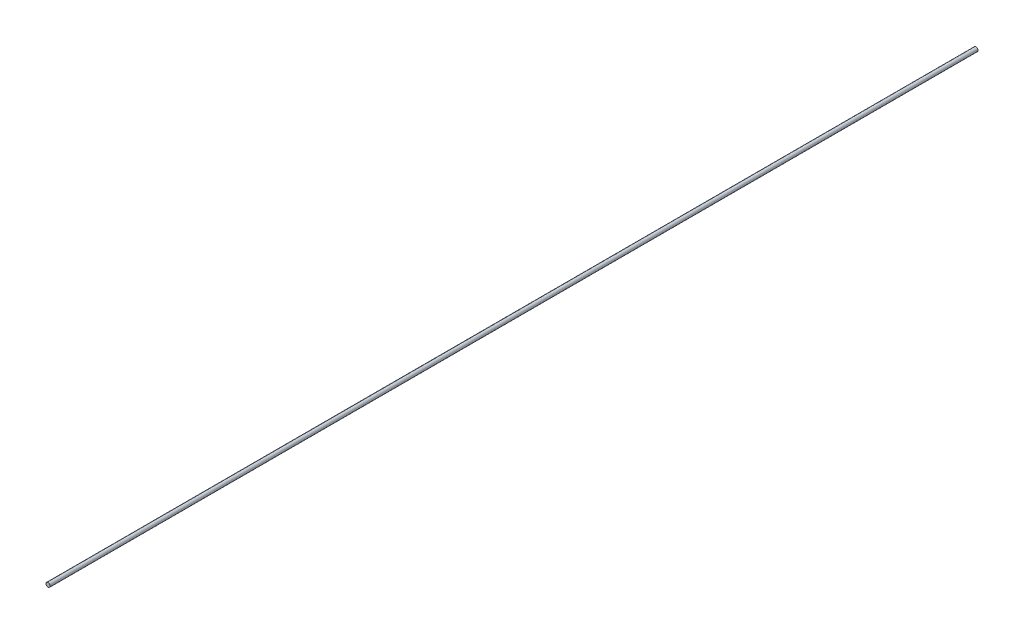
ISO-10303-21;
HEADER;
FILE_DESCRIPTION(('STEP AP214'),'2;1');
FILE_NAME('part.step','',(''),(''),'','','');
FILE_SCHEMA(('AUTOMOTIVE_DESIGN { 1 0 10303 214 1 1 1 1 }'));
ENDSEC;
DATA;
#1=APPLICATION_CONTEXT('core data for automotive mechanical design processes');
#2=APPLICATION_PROTOCOL_DEFINITION('international standard','automotive_design',2000,#1);
#3=PRODUCT_CONTEXT('',#1,'mechanical');
#4=PRODUCT('Part','Part','',(#3));
#5=PRODUCT_RELATED_PRODUCT_CATEGORY('part','',(#4));
#6=PRODUCT_DEFINITION_FORMATION('','',#4);
#7=PRODUCT_DEFINITION_CONTEXT('part definition',#1,'design');
#8=PRODUCT_DEFINITION('design','',#6,#7);
#9=PRODUCT_DEFINITION_SHAPE('','',#8);
#10=(LENGTH_UNIT() NAMED_UNIT(*) SI_UNIT(.MILLI.,.METRE.));
#11=(NAMED_UNIT(*) PLANE_ANGLE_UNIT() SI_UNIT($,.RADIAN.));
#12=(NAMED_UNIT(*) SI_UNIT($,.STERADIAN.) SOLID_ANGLE_UNIT());
#13=UNCERTAINTY_MEASURE_WITH_UNIT(LENGTH_MEASURE(1.E-05),#10,'distance_accuracy_value','');
#14=(GEOMETRIC_REPRESENTATION_CONTEXT(3) GLOBAL_UNCERTAINTY_ASSIGNED_CONTEXT((#13)) GLOBAL_UNIT_ASSIGNED_CONTEXT((#10,
#11,#12)) REPRESENTATION_CONTEXT('',''));
#15=CARTESIAN_POINT('',(0.,0.,0.));
#16=DIRECTION('',(0.,0.,1.));
#17=DIRECTION('',(1.,0.,0.));
#18=AXIS2_PLACEMENT_3D('',#15,#16,#17);
#19=CARTESIAN_POINT('',(0.,0.,1346.2));
#20=DIRECTION('',(0.,0.,-1.));
#21=DIRECTION('',(-1.,0.,0.));
#22=AXIS2_PLACEMENT_3D('',#19,#20,#21);
#23=CYLINDRICAL_SURFACE('',#22,3.);
#24=CARTESIAN_POINT('',(0.,0.,1346.2));
#25=DIRECTION('',(0.,0.,1.));
#26=DIRECTION('',(1.,0.,0.));
#27=AXIS2_PLACEMENT_3D('',#24,#25,#26);
#28=CIRCLE('',#27,3.);
#29=CARTESIAN_POINT('',(3.,0.,1346.2));
#30=VERTEX_POINT('',#29);
#31=EDGE_CURVE('E10',#30,#30,#28,.T.);
#32=ORIENTED_EDGE('',*,*,#31,.F.);
#33=EDGE_LOOP('',(#32));
#34=FACE_BOUND('',#33,.T.);
#35=CARTESIAN_POINT('',(0.,0.,0.));
#36=DIRECTION('',(0.,0.,1.));
#37=DIRECTION('',(1.,0.,0.));
#38=AXIS2_PLACEMENT_3D('',#35,#36,#37);
#39=CIRCLE('',#38,3.);
#40=CARTESIAN_POINT('',(3.,0.,0.));
#41=VERTEX_POINT('',#40);
#42=EDGE_CURVE('E35',#41,#41,#39,.T.);
#43=ORIENTED_EDGE('',*,*,#42,.T.);
#44=EDGE_LOOP('',(#43));
#45=FACE_BOUND('',#44,.T.);
#46=ADVANCED_FACE('F32',(#34,#45),#23,.T.);
#47=CARTESIAN_POINT('',(0.,0.,1346.2));
#48=DIRECTION('',(0.,0.,1.));
#49=DIRECTION('',(1.,0.,0.));
#50=AXIS2_PLACEMENT_3D('',#47,#48,#49);
#51=PLANE('',#50);
#52=ORIENTED_EDGE('',*,*,#31,.T.);
#53=EDGE_LOOP('',(#52));
#54=FACE_BOUND('',#53,.T.);
#55=ADVANCED_FACE('F47',(#54),#51,.T.);
#56=CARTESIAN_POINT('',(0.,0.,0.));
#57=DIRECTION('',(0.,0.,1.));
#58=DIRECTION('',(1.,0.,0.));
#59=AXIS2_PLACEMENT_3D('',#56,#57,#58);
#60=PLANE('',#59);
#61=ORIENTED_EDGE('',*,*,#42,.F.);
#62=EDGE_LOOP('',(#61));
#63=FACE_BOUND('',#62,.T.);
#64=ADVANCED_FACE('F45',(#63),#60,.F.);
#65=CLOSED_SHELL('',(#46,#55,#64));
#66=MANIFOLD_SOLID_BREP('B2',#65);
#67=ADVANCED_BREP_SHAPE_REPRESENTATION('',(#18,#66),#14);
#68=SHAPE_DEFINITION_REPRESENTATION(#9,#67);
ENDSEC;
END-ISO-10303-21;
